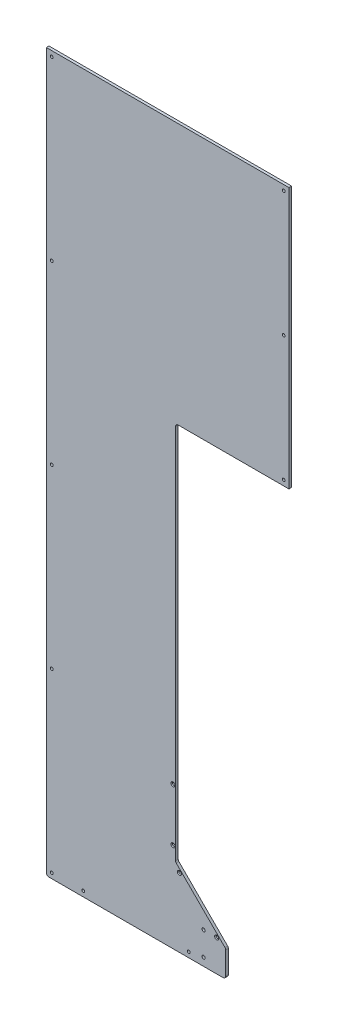
ISO-10303-21;
HEADER;
FILE_DESCRIPTION(('STEP AP214'),'2;1');
FILE_NAME('part.step','',(''),(''),'','','');
FILE_SCHEMA(('AUTOMOTIVE_DESIGN { 1 0 10303 214 1 1 1 1 }'));
ENDSEC;
DATA;
#1=APPLICATION_CONTEXT('core data for automotive mechanical design processes');
#2=APPLICATION_PROTOCOL_DEFINITION('international standard','automotive_design',2000,#1);
#3=PRODUCT_CONTEXT('',#1,'mechanical');
#4=PRODUCT('Part','Part','',(#3));
#5=PRODUCT_RELATED_PRODUCT_CATEGORY('part','',(#4));
#6=PRODUCT_DEFINITION_FORMATION('','',#4);
#7=PRODUCT_DEFINITION_CONTEXT('part definition',#1,'design');
#8=PRODUCT_DEFINITION('design','',#6,#7);
#9=PRODUCT_DEFINITION_SHAPE('','',#8);
#10=(LENGTH_UNIT() NAMED_UNIT(*) SI_UNIT(.MILLI.,.METRE.));
#11=(NAMED_UNIT(*) PLANE_ANGLE_UNIT() SI_UNIT($,.RADIAN.));
#12=(NAMED_UNIT(*) SI_UNIT($,.STERADIAN.) SOLID_ANGLE_UNIT());
#13=UNCERTAINTY_MEASURE_WITH_UNIT(LENGTH_MEASURE(1.E-05),#10,'distance_accuracy_value','');
#14=(GEOMETRIC_REPRESENTATION_CONTEXT(3) GLOBAL_UNCERTAINTY_ASSIGNED_CONTEXT((#13)) GLOBAL_UNIT_ASSIGNED_CONTEXT((#10,
#11,#12)) REPRESENTATION_CONTEXT('',''));
#15=CARTESIAN_POINT('',(0.,0.,0.));
#16=DIRECTION('',(0.,0.,1.));
#17=DIRECTION('',(1.,0.,0.));
#18=AXIS2_PLACEMENT_3D('',#15,#16,#17);
#19=CARTESIAN_POINT('',(0.,0.,6.35));
#20=DIRECTION('',(0.,0.,-1.));
#21=DIRECTION('',(-1.,0.,0.));
#22=AXIS2_PLACEMENT_3D('',#19,#20,#21);
#23=PLANE('',#22);
#24=CARTESIAN_POINT('',(378.46762,76.2,6.35));
#25=DIRECTION('',(0.,0.,-1.));
#26=DIRECTION('',(-1.,0.,0.));
#27=AXIS2_PLACEMENT_3D('',#24,#25,#26);
#28=CIRCLE('',#27,3.937);
#29=CARTESIAN_POINT('',(374.53062,76.2,6.35));
#30=VERTEX_POINT('',#29);
#31=EDGE_CURVE('E702',#30,#30,#28,.T.);
#32=ORIENTED_EDGE('',*,*,#31,.T.);
#33=EDGE_LOOP('',(#32));
#34=FACE_BOUND('',#33,.T.);
#35=CARTESIAN_POINT('',(378.46762,19.05,6.35));
#36=DIRECTION('',(0.,0.,-1.));
#37=DIRECTION('',(-1.,0.,0.));
#38=AXIS2_PLACEMENT_3D('',#35,#36,#37);
#39=CIRCLE('',#38,3.937);
#40=CARTESIAN_POINT('',(374.53062,19.05,6.35));
#41=VERTEX_POINT('',#40);
#42=EDGE_CURVE('E706',#41,#41,#39,.T.);
#43=ORIENTED_EDGE('',*,*,#42,.T.);
#44=EDGE_LOOP('',(#43));
#45=FACE_BOUND('',#44,.T.);
#46=CARTESIAN_POINT('',(304.8,342.9,6.35));
#47=DIRECTION('',(0.,0.,1.));
#48=DIRECTION('',(1.,0.,0.));
#49=AXIS2_PLACEMENT_3D('',#46,#47,#48);
#50=CIRCLE('',#49,4.88949999999999);
#51=CARTESIAN_POINT('',(309.6895,342.9,6.35));
#52=VERTEX_POINT('',#51);
#53=EDGE_CURVE('E708',#52,#52,#50,.T.);
#54=ORIENTED_EDGE('',*,*,#53,.F.);
#55=EDGE_LOOP('',(#54));
#56=FACE_BOUND('',#55,.T.);
#57=CARTESIAN_POINT('',(304.8,215.9,6.35));
#58=DIRECTION('',(0.,0.,1.));
#59=DIRECTION('',(1.,0.,0.));
#60=AXIS2_PLACEMENT_3D('',#57,#58,#59);
#61=CIRCLE('',#60,4.88949999999999);
#62=CARTESIAN_POINT('',(309.6895,215.9,6.35));
#63=VERTEX_POINT('',#62);
#64=EDGE_CURVE('E724',#63,#63,#61,.T.);
#65=ORIENTED_EDGE('',*,*,#64,.F.);
#66=EDGE_LOOP('',(#65));
#67=FACE_BOUND('',#66,.T.);
#68=CARTESIAN_POINT('',(88.9,12.7,6.35));
#69=DIRECTION('',(0.,0.,1.));
#70=DIRECTION('',(1.,0.,0.));
#71=AXIS2_PLACEMENT_3D('',#68,#69,#70);
#72=CIRCLE('',#71,3.37819999999999);
#73=CARTESIAN_POINT('',(92.2782,12.7,6.35));
#74=VERTEX_POINT('',#73);
#75=EDGE_CURVE('E211',#74,#74,#72,.T.);
#76=ORIENTED_EDGE('',*,*,#75,.F.);
#77=EDGE_LOOP('',(#76));
#78=FACE_BOUND('',#77,.T.);
#79=CARTESIAN_POINT('',(342.9,12.7,6.35));
#80=DIRECTION('',(0.,0.,1.));
#81=DIRECTION('',(1.,0.,0.));
#82=AXIS2_PLACEMENT_3D('',#79,#80,#81);
#83=CIRCLE('',#82,3.37819999999999);
#84=CARTESIAN_POINT('',(346.2782,12.7,6.35));
#85=VERTEX_POINT('',#84);
#86=EDGE_CURVE('E217',#85,#85,#83,.T.);
#87=ORIENTED_EDGE('',*,*,#86,.F.);
#88=EDGE_LOOP('',(#87));
#89=FACE_BOUND('',#88,.T.);
#90=CARTESIAN_POINT('',(12.7,1714.5,6.35));
#91=DIRECTION('',(0.,0.,1.));
#92=DIRECTION('',(1.,0.,0.));
#93=AXIS2_PLACEMENT_3D('',#90,#91,#92);
#94=CIRCLE('',#93,3.37819999999999);
#95=CARTESIAN_POINT('',(16.0782,1714.5,6.35));
#96=VERTEX_POINT('',#95);
#97=EDGE_CURVE('E215',#96,#96,#94,.T.);
#98=ORIENTED_EDGE('',*,*,#97,.F.);
#99=EDGE_LOOP('',(#98));
#100=FACE_BOUND('',#99,.T.);
#101=CARTESIAN_POINT('',(12.7,1289.05,6.35));
#102=DIRECTION('',(0.,0.,1.));
#103=DIRECTION('',(1.,0.,0.));
#104=AXIS2_PLACEMENT_3D('',#101,#102,#103);
#105=CIRCLE('',#104,3.37819999999999);
#106=CARTESIAN_POINT('',(16.0782,1289.05,6.35));
#107=VERTEX_POINT('',#106);
#108=EDGE_CURVE('E232',#107,#107,#105,.T.);
#109=ORIENTED_EDGE('',*,*,#108,.F.);
#110=EDGE_LOOP('',(#109));
#111=FACE_BOUND('',#110,.T.);
#112=CARTESIAN_POINT('',(12.7,863.6,6.35));
#113=DIRECTION('',(0.,0.,1.));
#114=DIRECTION('',(1.,0.,0.));
#115=AXIS2_PLACEMENT_3D('',#112,#113,#114);
#116=CIRCLE('',#115,3.37819999999999);
#117=CARTESIAN_POINT('',(16.0782,863.6,6.35));
#118=VERTEX_POINT('',#117);
#119=EDGE_CURVE('E238',#118,#118,#116,.T.);
#120=ORIENTED_EDGE('',*,*,#119,.F.);
#121=EDGE_LOOP('',(#120));
#122=FACE_BOUND('',#121,.T.);
#123=CARTESIAN_POINT('',(12.7,438.15,6.35));
#124=DIRECTION('',(0.,0.,1.));
#125=DIRECTION('',(1.,0.,0.));
#126=AXIS2_PLACEMENT_3D('',#123,#124,#125);
#127=CIRCLE('',#126,3.37819999999999);
#128=CARTESIAN_POINT('',(16.0782,438.15,6.35));
#129=VERTEX_POINT('',#128);
#130=EDGE_CURVE('E244',#129,#129,#127,.T.);
#131=ORIENTED_EDGE('',*,*,#130,.F.);
#132=EDGE_LOOP('',(#131));
#133=FACE_BOUND('',#132,.T.);
#134=CARTESIAN_POINT('',(12.7,12.7,6.35));
#135=DIRECTION('',(0.,0.,1.));
#136=DIRECTION('',(1.,0.,0.));
#137=AXIS2_PLACEMENT_3D('',#134,#135,#136);
#138=CIRCLE('',#137,3.37819999999999);
#139=CARTESIAN_POINT('',(16.0782,12.7,6.35));
#140=VERTEX_POINT('',#139);
#141=EDGE_CURVE('E250',#140,#140,#138,.T.);
#142=ORIENTED_EDGE('',*,*,#141,.F.);
#143=EDGE_LOOP('',(#142));
#144=FACE_BOUND('',#143,.T.);
#145=CARTESIAN_POINT('',(571.5,1111.25,6.35));
#146=DIRECTION('',(0.,0.,1.));
#147=DIRECTION('',(1.,0.,0.));
#148=AXIS2_PLACEMENT_3D('',#145,#146,#147);
#149=CIRCLE('',#148,3.3782);
#150=CARTESIAN_POINT('',(574.8782,1111.25,6.35));
#151=VERTEX_POINT('',#150);
#152=EDGE_CURVE('E256',#151,#151,#149,.T.);
#153=ORIENTED_EDGE('',*,*,#152,.F.);
#154=EDGE_LOOP('',(#153));
#155=FACE_BOUND('',#154,.T.);
#156=CARTESIAN_POINT('',(571.5,1412.875,6.35));
#157=DIRECTION('',(0.,0.,1.));
#158=DIRECTION('',(1.,0.,0.));
#159=AXIS2_PLACEMENT_3D('',#156,#157,#158);
#160=CIRCLE('',#159,3.3782);
#161=CARTESIAN_POINT('',(574.8782,1412.875,6.35));
#162=VERTEX_POINT('',#161);
#163=EDGE_CURVE('E262',#162,#162,#160,.T.);
#164=ORIENTED_EDGE('',*,*,#163,.F.);
#165=EDGE_LOOP('',(#164));
#166=FACE_BOUND('',#165,.T.);
#167=CARTESIAN_POINT('',(571.5,1714.5,6.35));
#168=DIRECTION('',(0.,0.,1.));
#169=DIRECTION('',(1.,0.,0.));
#170=AXIS2_PLACEMENT_3D('',#167,#168,#169);
#171=CIRCLE('',#170,3.3782);
#172=CARTESIAN_POINT('',(574.8782,1714.5,6.35));
#173=VERTEX_POINT('',#172);
#174=EDGE_CURVE('E268',#173,#173,#171,.T.);
#175=ORIENTED_EDGE('',*,*,#174,.F.);
#176=EDGE_LOOP('',(#175));
#177=FACE_BOUND('',#176,.T.);
#178=DIRECTION('',(0.,-1.,0.));
#179=VECTOR('',#178,1.);
#180=CARTESIAN_POINT('',(0.,0.,6.35));
#181=LINE('',#180,#179);
#182=CARTESIAN_POINT('',(0.,1727.2,6.35));
#183=VERTEX_POINT('',#182);
#184=CARTESIAN_POINT('',(0.,6.35,6.35));
#185=VERTEX_POINT('',#184);
#186=EDGE_CURVE('E158',#183,#185,#181,.T.);
#187=ORIENTED_EDGE('',*,*,#186,.T.);
#188=CARTESIAN_POINT('',(6.35,6.35,6.35));
#189=DIRECTION('',(0.,0.,-1.));
#190=DIRECTION('',(-1.,0.,0.));
#191=AXIS2_PLACEMENT_3D('',#188,#189,#190);
#192=CIRCLE('',#191,6.35);
#193=CARTESIAN_POINT('',(6.35,0.,6.35));
#194=VERTEX_POINT('',#193);
#195=EDGE_CURVE('E188',#185,#194,#192,.F.);
#196=ORIENTED_EDGE('',*,*,#195,.T.);
#197=DIRECTION('',(1.,0.,0.));
#198=VECTOR('',#197,1.);
#199=CARTESIAN_POINT('',(0.,0.,6.35));
#200=LINE('',#199,#198);
#201=CARTESIAN_POINT('',(425.45,0.,6.35));
#202=VERTEX_POINT('',#201);
#203=EDGE_CURVE('E292',#194,#202,#200,.T.);
#204=ORIENTED_EDGE('',*,*,#203,.T.);
#205=CARTESIAN_POINT('',(425.45,6.35,6.35));
#206=DIRECTION('',(0.,0.,-1.));
#207=DIRECTION('',(-1.,0.,0.));
#208=AXIS2_PLACEMENT_3D('',#205,#206,#207);
#209=CIRCLE('',#208,6.35);
#210=CARTESIAN_POINT('',(431.8,6.35,6.35));
#211=VERTEX_POINT('',#210);
#212=EDGE_CURVE('E186',#202,#211,#209,.F.);
#213=ORIENTED_EDGE('',*,*,#212,.T.);
#214=DIRECTION('',(0.,-1.,0.));
#215=VECTOR('',#214,1.);
#216=CARTESIAN_POINT('',(431.8,63.5,6.35));
#217=LINE('',#216,#215);
#218=CARTESIAN_POINT('',(431.8,60.8697438789308,6.35));
#219=VERTEX_POINT('',#218);
#220=EDGE_CURVE('E139',#219,#211,#217,.T.);
#221=ORIENTED_EDGE('',*,*,#220,.F.);
#222=CARTESIAN_POINT('',(425.45,60.8697438789308,6.35));
#223=DIRECTION('',(0.,0.,-1.));
#224=DIRECTION('',(-1.,0.,0.));
#225=AXIS2_PLACEMENT_3D('',#222,#223,#224);
#226=CIRCLE('',#225,6.35);
#227=CARTESIAN_POINT('',(429.940128060535,65.3598719394654,6.35));
#228=VERTEX_POINT('',#227);
#229=EDGE_CURVE('E184',#219,#228,#226,.F.);
#230=ORIENTED_EDGE('',*,*,#229,.T.);
#231=DIRECTION('',(0.70710678118655,-0.707106781186545,0.));
#232=VECTOR('',#231,1.);
#233=CARTESIAN_POINT('',(311.15,184.149999999999,6.35));
#234=LINE('',#233,#232);
#235=CARTESIAN_POINT('',(313.009871939466,182.290128060534,6.35));
#236=VERTEX_POINT('',#235);
#237=EDGE_CURVE('E285',#236,#228,#234,.T.);
#238=ORIENTED_EDGE('',*,*,#237,.F.);
#239=CARTESIAN_POINT('',(317.5,186.780256121068,6.35));
#240=DIRECTION('',(0.,0.,-1.));
#241=DIRECTION('',(-1.,0.,0.));
#242=AXIS2_PLACEMENT_3D('',#239,#240,#241);
#243=CIRCLE('',#242,6.35);
#244=CARTESIAN_POINT('',(311.15,186.780256121068,6.35));
#245=VERTEX_POINT('',#244);
#246=EDGE_CURVE('E57',#236,#245,#243,.T.);
#247=ORIENTED_EDGE('',*,*,#246,.T.);
#248=DIRECTION('',(0.,-1.,0.));
#249=VECTOR('',#248,1.);
#250=CARTESIAN_POINT('',(311.15,1098.55,6.35));
#251=LINE('',#250,#249);
#252=CARTESIAN_POINT('',(311.15,1092.2,6.35));
#253=VERTEX_POINT('',#252);
#254=EDGE_CURVE('E283',#253,#245,#251,.T.);
#255=ORIENTED_EDGE('',*,*,#254,.F.);
#256=CARTESIAN_POINT('',(317.5,1092.2,6.35));
#257=DIRECTION('',(0.,0.,-1.));
#258=DIRECTION('',(-1.,0.,0.));
#259=AXIS2_PLACEMENT_3D('',#256,#257,#258);
#260=CIRCLE('',#259,6.35);
#261=CARTESIAN_POINT('',(317.5,1098.55,6.35));
#262=VERTEX_POINT('',#261);
#263=EDGE_CURVE('E44',#253,#262,#260,.T.);
#264=ORIENTED_EDGE('',*,*,#263,.T.);
#265=DIRECTION('',(-1.,0.,0.));
#266=VECTOR('',#265,1.);
#267=CARTESIAN_POINT('',(584.2,1098.55,6.35));
#268=LINE('',#267,#266);
#269=CARTESIAN_POINT('',(584.2,1098.55,6.35));
#270=VERTEX_POINT('',#269);
#271=EDGE_CURVE('E273',#270,#262,#268,.T.);
#272=ORIENTED_EDGE('',*,*,#271,.F.);
#273=DIRECTION('',(0.,1.,0.));
#274=VECTOR('',#273,1.);
#275=CARTESIAN_POINT('',(584.2,0.,6.35));
#276=LINE('',#275,#274);
#277=CARTESIAN_POINT('',(584.2,1727.2,6.35));
#278=VERTEX_POINT('',#277);
#279=EDGE_CURVE('E147',#270,#278,#276,.T.);
#280=ORIENTED_EDGE('',*,*,#279,.T.);
#281=DIRECTION('',(-1.,0.,0.));
#282=VECTOR('',#281,1.);
#283=CARTESIAN_POINT('',(0.,1727.2,6.35));
#284=LINE('',#283,#282);
#285=EDGE_CURVE('E168',#278,#183,#284,.T.);
#286=ORIENTED_EDGE('',*,*,#285,.T.);
#287=EDGE_LOOP('',(#187,#196,#204,#213,#221,#230,#238,#247,#255,#264,#272,#280,#286));
#288=FACE_BOUND('',#287,.T.);
#289=CARTESIAN_POINT('',(410.11974387893,76.2,6.35));
#290=DIRECTION('',(0.,0.,1.));
#291=DIRECTION('',(1.,0.,0.));
#292=AXIS2_PLACEMENT_3D('',#289,#290,#291);
#293=CIRCLE('',#292,4.88949999999999);
#294=CARTESIAN_POINT('',(415.00924387893,76.2,6.35));
#295=VERTEX_POINT('',#294);
#296=EDGE_CURVE('E742',#295,#295,#293,.T.);
#297=ORIENTED_EDGE('',*,*,#296,.F.);
#298=EDGE_LOOP('',(#297));
#299=FACE_BOUND('',#298,.T.);
#300=CARTESIAN_POINT('',(320.317182668239,166.002561210692,6.35));
#301=DIRECTION('',(0.,0.,1.));
#302=DIRECTION('',(1.,0.,0.));
#303=AXIS2_PLACEMENT_3D('',#300,#301,#302);
#304=CIRCLE('',#303,4.88949999999999);
#305=CARTESIAN_POINT('',(325.206682668239,166.002561210692,6.35));
#306=VERTEX_POINT('',#305);
#307=EDGE_CURVE('E733',#306,#306,#304,.T.);
#308=ORIENTED_EDGE('',*,*,#307,.F.);
#309=EDGE_LOOP('',(#308));
#310=FACE_BOUND('',#309,.T.);
#311=ADVANCED_FACE('F35',(#34,#45,#56,#67,#78,#89,#100,#111,#122,#133,#144,#155,#166,#177,#288,
#299,#310),#23,.F.);
#312=CARTESIAN_POINT('',(0.,0.,6.35));
#313=DIRECTION('',(1.,0.,0.));
#314=DIRECTION('',(0.,0.,-1.));
#315=AXIS2_PLACEMENT_3D('',#312,#313,#314);
#316=PLANE('',#315);
#317=DIRECTION('',(0.,-1.,0.));
#318=VECTOR('',#317,1.);
#319=CARTESIAN_POINT('',(0.,0.,0.));
#320=LINE('',#319,#318);
#321=CARTESIAN_POINT('',(0.,1727.2,0.));
#322=VERTEX_POINT('',#321);
#323=CARTESIAN_POINT('',(0.,6.35,0.));
#324=VERTEX_POINT('',#323);
#325=EDGE_CURVE('E148',#322,#324,#320,.T.);
#326=ORIENTED_EDGE('',*,*,#325,.T.);
#327=DIRECTION('',(0.,0.,-1.));
#328=VECTOR('',#327,1.);
#329=CARTESIAN_POINT('',(0.,6.35,6.35));
#330=LINE('',#329,#328);
#331=EDGE_CURVE('E182',#324,#185,#330,.F.);
#332=ORIENTED_EDGE('',*,*,#331,.T.);
#333=ORIENTED_EDGE('',*,*,#186,.F.);
#334=DIRECTION('',(0.,0.,-1.));
#335=VECTOR('',#334,1.);
#336=CARTESIAN_POINT('',(0.,1727.2,6.35));
#337=LINE('',#336,#335);
#338=EDGE_CURVE('E164',#183,#322,#337,.T.);
#339=ORIENTED_EDGE('',*,*,#338,.T.);
#340=EDGE_LOOP('',(#326,#332,#333,#339));
#341=FACE_BOUND('',#340,.T.);
#342=ADVANCED_FACE('F299',(#341),#316,.F.);
#343=CARTESIAN_POINT('',(0.,0.,6.35));
#344=DIRECTION('',(0.,1.,0.));
#345=DIRECTION('',(0.,0.,1.));
#346=AXIS2_PLACEMENT_3D('',#343,#344,#345);
#347=PLANE('',#346);
#348=ORIENTED_EDGE('',*,*,#203,.F.);
#349=DIRECTION('',(0.,0.,-1.));
#350=VECTOR('',#349,1.);
#351=CARTESIAN_POINT('',(6.35,0.,6.35));
#352=LINE('',#351,#350);
#353=CARTESIAN_POINT('',(6.35,0.,0.));
#354=VERTEX_POINT('',#353);
#355=EDGE_CURVE('E173',#194,#354,#352,.T.);
#356=ORIENTED_EDGE('',*,*,#355,.T.);
#357=DIRECTION('',(1.,0.,0.));
#358=VECTOR('',#357,1.);
#359=CARTESIAN_POINT('',(0.,0.,0.));
#360=LINE('',#359,#358);
#361=CARTESIAN_POINT('',(425.45,0.,0.));
#362=VERTEX_POINT('',#361);
#363=EDGE_CURVE('E156',#354,#362,#360,.T.);
#364=ORIENTED_EDGE('',*,*,#363,.T.);
#365=DIRECTION('',(0.,0.,1.));
#366=VECTOR('',#365,1.);
#367=CARTESIAN_POINT('',(425.45,0.,6.35));
#368=LINE('',#367,#366);
#369=EDGE_CURVE('E170',#362,#202,#368,.T.);
#370=ORIENTED_EDGE('',*,*,#369,.T.);
#371=EDGE_LOOP('',(#348,#356,#364,#370));
#372=FACE_BOUND('',#371,.T.);
#373=ADVANCED_FACE('F309',(#372),#347,.F.);
#374=CARTESIAN_POINT('',(584.2,0.,6.35));
#375=DIRECTION('',(-1.,0.,0.));
#376=DIRECTION('',(0.,0.,1.));
#377=AXIS2_PLACEMENT_3D('',#374,#375,#376);
#378=PLANE('',#377);
#379=ORIENTED_EDGE('',*,*,#279,.F.);
#380=DIRECTION('',(0.,0.,1.));
#381=VECTOR('',#380,1.);
#382=CARTESIAN_POINT('',(584.2,1098.55,0.));
#383=LINE('',#382,#381);
#384=CARTESIAN_POINT('',(584.2,1098.55,0.));
#385=VERTEX_POINT('',#384);
#386=EDGE_CURVE('E132',#385,#270,#383,.T.);
#387=ORIENTED_EDGE('',*,*,#386,.F.);
#388=DIRECTION('',(0.,1.,0.));
#389=VECTOR('',#388,1.);
#390=CARTESIAN_POINT('',(584.2,0.,0.));
#391=LINE('',#390,#389);
#392=CARTESIAN_POINT('',(584.2,1727.2,0.));
#393=VERTEX_POINT('',#392);
#394=EDGE_CURVE('E145',#385,#393,#391,.T.);
#395=ORIENTED_EDGE('',*,*,#394,.T.);
#396=DIRECTION('',(0.,0.,-1.));
#397=VECTOR('',#396,1.);
#398=CARTESIAN_POINT('',(584.2,1727.2,6.35));
#399=LINE('',#398,#397);
#400=EDGE_CURVE('E167',#278,#393,#399,.T.);
#401=ORIENTED_EDGE('',*,*,#400,.F.);
#402=EDGE_LOOP('',(#379,#387,#395,#401));
#403=FACE_BOUND('',#402,.T.);
#404=ADVANCED_FACE('F143',(#403),#378,.F.);
#405=CARTESIAN_POINT('',(0.,1727.2,6.35));
#406=DIRECTION('',(0.,-1.,0.));
#407=DIRECTION('',(0.,0.,-1.));
#408=AXIS2_PLACEMENT_3D('',#405,#406,#407);
#409=PLANE('',#408);
#410=DIRECTION('',(-1.,0.,0.));
#411=VECTOR('',#410,1.);
#412=CARTESIAN_POINT('',(0.,1727.2,0.));
#413=LINE('',#412,#411);
#414=EDGE_CURVE('E155',#393,#322,#413,.T.);
#415=ORIENTED_EDGE('',*,*,#414,.T.);
#416=ORIENTED_EDGE('',*,*,#338,.F.);
#417=ORIENTED_EDGE('',*,*,#285,.F.);
#418=ORIENTED_EDGE('',*,*,#400,.T.);
#419=EDGE_LOOP('',(#415,#416,#417,#418));
#420=FACE_BOUND('',#419,.T.);
#421=ADVANCED_FACE('F359',(#420),#409,.F.);
#422=CARTESIAN_POINT('',(0.,0.,0.));
#423=DIRECTION('',(0.,0.,-1.));
#424=DIRECTION('',(-1.,0.,0.));
#425=AXIS2_PLACEMENT_3D('',#422,#423,#424);
#426=PLANE('',#425);
#427=CARTESIAN_POINT('',(378.46762,76.2,0.));
#428=DIRECTION('',(0.,0.,-1.));
#429=DIRECTION('',(-1.,0.,0.));
#430=AXIS2_PLACEMENT_3D('',#427,#428,#429);
#431=CIRCLE('',#430,3.937);
#432=CARTESIAN_POINT('',(374.53062,76.2,0.));
#433=VERTEX_POINT('',#432);
#434=EDGE_CURVE('E705',#433,#433,#431,.T.);
#435=ORIENTED_EDGE('',*,*,#434,.F.);
#436=EDGE_LOOP('',(#435));
#437=FACE_BOUND('',#436,.T.);
#438=CARTESIAN_POINT('',(378.46762,19.05,0.));
#439=DIRECTION('',(0.,0.,-1.));
#440=DIRECTION('',(-1.,0.,0.));
#441=AXIS2_PLACEMENT_3D('',#438,#439,#440);
#442=CIRCLE('',#441,3.937);
#443=CARTESIAN_POINT('',(374.53062,19.05,0.));
#444=VERTEX_POINT('',#443);
#445=EDGE_CURVE('E711',#444,#444,#442,.T.);
#446=ORIENTED_EDGE('',*,*,#445,.F.);
#447=EDGE_LOOP('',(#446));
#448=FACE_BOUND('',#447,.T.);
#449=CARTESIAN_POINT('',(304.8,342.9,0.));
#450=DIRECTION('',(0.,0.,-1.));
#451=DIRECTION('',(-1.,0.,0.));
#452=AXIS2_PLACEMENT_3D('',#449,#450,#451);
#453=CIRCLE('',#452,2.8067);
#454=CARTESIAN_POINT('',(301.9933,342.9,0.));
#455=VERTEX_POINT('',#454);
#456=EDGE_CURVE('E721',#455,#455,#453,.T.);
#457=ORIENTED_EDGE('',*,*,#456,.F.);
#458=EDGE_LOOP('',(#457));
#459=FACE_BOUND('',#458,.T.);
#460=CARTESIAN_POINT('',(304.8,215.9,0.));
#461=DIRECTION('',(0.,0.,-1.));
#462=DIRECTION('',(-1.,0.,0.));
#463=AXIS2_PLACEMENT_3D('',#460,#461,#462);
#464=CIRCLE('',#463,2.8067);
#465=CARTESIAN_POINT('',(301.9933,215.9,0.));
#466=VERTEX_POINT('',#465);
#467=EDGE_CURVE('E730',#466,#466,#464,.T.);
#468=ORIENTED_EDGE('',*,*,#467,.F.);
#469=EDGE_LOOP('',(#468));
#470=FACE_BOUND('',#469,.T.);
#471=CARTESIAN_POINT('',(320.317182668239,166.002561210692,0.));
#472=DIRECTION('',(0.,0.,-1.));
#473=DIRECTION('',(-1.,0.,0.));
#474=AXIS2_PLACEMENT_3D('',#471,#472,#473);
#475=CIRCLE('',#474,2.8067);
#476=CARTESIAN_POINT('',(317.510482668239,166.002561210692,0.));
#477=VERTEX_POINT('',#476);
#478=EDGE_CURVE('E739',#477,#477,#475,.T.);
#479=ORIENTED_EDGE('',*,*,#478,.F.);
#480=EDGE_LOOP('',(#479));
#481=FACE_BOUND('',#480,.T.);
#482=CARTESIAN_POINT('',(410.11974387893,76.2,0.));
#483=DIRECTION('',(0.,0.,-1.));
#484=DIRECTION('',(-1.,0.,0.));
#485=AXIS2_PLACEMENT_3D('',#482,#483,#484);
#486=CIRCLE('',#485,2.8067);
#487=CARTESIAN_POINT('',(407.31304387893,76.2,0.));
#488=VERTEX_POINT('',#487);
#489=EDGE_CURVE('E222',#488,#488,#486,.T.);
#490=ORIENTED_EDGE('',*,*,#489,.F.);
#491=EDGE_LOOP('',(#490));
#492=FACE_BOUND('',#491,.T.);
#493=CARTESIAN_POINT('',(88.9,12.7,0.));
#494=DIRECTION('',(0.,0.,-1.));
#495=DIRECTION('',(-1.,0.,0.));
#496=AXIS2_PLACEMENT_3D('',#493,#494,#495);
#497=CIRCLE('',#496,3.37819999999999);
#498=CARTESIAN_POINT('',(85.5218,12.7,0.));
#499=VERTEX_POINT('',#498);
#500=EDGE_CURVE('E39',#499,#499,#497,.T.);
#501=ORIENTED_EDGE('',*,*,#500,.F.);
#502=EDGE_LOOP('',(#501));
#503=FACE_BOUND('',#502,.T.);
#504=CARTESIAN_POINT('',(342.9,12.7,0.));
#505=DIRECTION('',(0.,0.,-1.));
#506=DIRECTION('',(-1.,0.,0.));
#507=AXIS2_PLACEMENT_3D('',#504,#505,#506);
#508=CIRCLE('',#507,3.37819999999999);
#509=CARTESIAN_POINT('',(339.5218,12.7,0.));
#510=VERTEX_POINT('',#509);
#511=EDGE_CURVE('E209',#510,#510,#508,.T.);
#512=ORIENTED_EDGE('',*,*,#511,.F.);
#513=EDGE_LOOP('',(#512));
#514=FACE_BOUND('',#513,.T.);
#515=CARTESIAN_POINT('',(12.7,1714.5,0.));
#516=DIRECTION('',(0.,0.,1.));
#517=DIRECTION('',(1.,0.,0.));
#518=AXIS2_PLACEMENT_3D('',#515,#516,#517);
#519=CIRCLE('',#518,3.37819999999999);
#520=CARTESIAN_POINT('',(16.0782,1714.5,0.));
#521=VERTEX_POINT('',#520);
#522=EDGE_CURVE('E229',#521,#521,#519,.T.);
#523=ORIENTED_EDGE('',*,*,#522,.T.);
#524=EDGE_LOOP('',(#523));
#525=FACE_BOUND('',#524,.T.);
#526=CARTESIAN_POINT('',(12.7,1289.05,0.));
#527=DIRECTION('',(0.,0.,1.));
#528=DIRECTION('',(1.,0.,0.));
#529=AXIS2_PLACEMENT_3D('',#526,#527,#528);
#530=CIRCLE('',#529,3.37819999999999);
#531=CARTESIAN_POINT('',(16.0782,1289.05,0.));
#532=VERTEX_POINT('',#531);
#533=EDGE_CURVE('E235',#532,#532,#530,.T.);
#534=ORIENTED_EDGE('',*,*,#533,.T.);
#535=EDGE_LOOP('',(#534));
#536=FACE_BOUND('',#535,.T.);
#537=CARTESIAN_POINT('',(12.7,863.6,0.));
#538=DIRECTION('',(0.,0.,1.));
#539=DIRECTION('',(1.,0.,0.));
#540=AXIS2_PLACEMENT_3D('',#537,#538,#539);
#541=CIRCLE('',#540,3.37819999999999);
#542=CARTESIAN_POINT('',(16.0782,863.6,0.));
#543=VERTEX_POINT('',#542);
#544=EDGE_CURVE('E241',#543,#543,#541,.T.);
#545=ORIENTED_EDGE('',*,*,#544,.T.);
#546=EDGE_LOOP('',(#545));
#547=FACE_BOUND('',#546,.T.);
#548=CARTESIAN_POINT('',(12.7,438.15,0.));
#549=DIRECTION('',(0.,0.,1.));
#550=DIRECTION('',(1.,0.,0.));
#551=AXIS2_PLACEMENT_3D('',#548,#549,#550);
#552=CIRCLE('',#551,3.37819999999999);
#553=CARTESIAN_POINT('',(16.0782,438.15,0.));
#554=VERTEX_POINT('',#553);
#555=EDGE_CURVE('E247',#554,#554,#552,.T.);
#556=ORIENTED_EDGE('',*,*,#555,.T.);
#557=EDGE_LOOP('',(#556));
#558=FACE_BOUND('',#557,.T.);
#559=CARTESIAN_POINT('',(12.7,12.7,0.));
#560=DIRECTION('',(0.,0.,1.));
#561=DIRECTION('',(1.,0.,0.));
#562=AXIS2_PLACEMENT_3D('',#559,#560,#561);
#563=CIRCLE('',#562,3.37819999999999);
#564=CARTESIAN_POINT('',(16.0782,12.7,0.));
#565=VERTEX_POINT('',#564);
#566=EDGE_CURVE('E253',#565,#565,#563,.T.);
#567=ORIENTED_EDGE('',*,*,#566,.T.);
#568=EDGE_LOOP('',(#567));
#569=FACE_BOUND('',#568,.T.);
#570=CARTESIAN_POINT('',(571.5,1111.25,0.));
#571=DIRECTION('',(0.,0.,1.));
#572=DIRECTION('',(1.,0.,0.));
#573=AXIS2_PLACEMENT_3D('',#570,#571,#572);
#574=CIRCLE('',#573,3.3782);
#575=CARTESIAN_POINT('',(574.8782,1111.25,0.));
#576=VERTEX_POINT('',#575);
#577=EDGE_CURVE('E259',#576,#576,#574,.T.);
#578=ORIENTED_EDGE('',*,*,#577,.T.);
#579=EDGE_LOOP('',(#578));
#580=FACE_BOUND('',#579,.T.);
#581=CARTESIAN_POINT('',(571.5,1412.875,0.));
#582=DIRECTION('',(0.,0.,1.));
#583=DIRECTION('',(1.,0.,0.));
#584=AXIS2_PLACEMENT_3D('',#581,#582,#583);
#585=CIRCLE('',#584,3.3782);
#586=CARTESIAN_POINT('',(574.8782,1412.875,0.));
#587=VERTEX_POINT('',#586);
#588=EDGE_CURVE('E265',#587,#587,#585,.T.);
#589=ORIENTED_EDGE('',*,*,#588,.T.);
#590=EDGE_LOOP('',(#589));
#591=FACE_BOUND('',#590,.T.);
#592=CARTESIAN_POINT('',(571.5,1714.5,0.));
#593=DIRECTION('',(0.,0.,1.));
#594=DIRECTION('',(1.,0.,0.));
#595=AXIS2_PLACEMENT_3D('',#592,#593,#594);
#596=CIRCLE('',#595,3.3782);
#597=CARTESIAN_POINT('',(574.8782,1714.5,0.));
#598=VERTEX_POINT('',#597);
#599=EDGE_CURVE('E271',#598,#598,#596,.T.);
#600=ORIENTED_EDGE('',*,*,#599,.T.);
#601=EDGE_LOOP('',(#600));
#602=FACE_BOUND('',#601,.T.);
#603=ORIENTED_EDGE('',*,*,#363,.F.);
#604=CARTESIAN_POINT('',(6.35,6.35,0.));
#605=DIRECTION('',(0.,0.,-1.));
#606=DIRECTION('',(-1.,0.,0.));
#607=AXIS2_PLACEMENT_3D('',#604,#605,#606);
#608=CIRCLE('',#607,6.35);
#609=EDGE_CURVE('E180',#354,#324,#608,.T.);
#610=ORIENTED_EDGE('',*,*,#609,.T.);
#611=ORIENTED_EDGE('',*,*,#325,.F.);
#612=ORIENTED_EDGE('',*,*,#414,.F.);
#613=ORIENTED_EDGE('',*,*,#394,.F.);
#614=DIRECTION('',(-1.,0.,0.));
#615=VECTOR('',#614,1.);
#616=CARTESIAN_POINT('',(584.2,1098.55,0.));
#617=LINE('',#616,#615);
#618=CARTESIAN_POINT('',(317.5,1098.55,0.));
#619=VERTEX_POINT('',#618);
#620=EDGE_CURVE('E129',#385,#619,#617,.T.);
#621=ORIENTED_EDGE('',*,*,#620,.T.);
#622=CARTESIAN_POINT('',(317.5,1092.2,0.));
#623=DIRECTION('',(0.,0.,-1.));
#624=DIRECTION('',(-1.,0.,0.));
#625=AXIS2_PLACEMENT_3D('',#622,#623,#624);
#626=CIRCLE('',#625,6.35);
#627=CARTESIAN_POINT('',(311.15,1092.2,0.));
#628=VERTEX_POINT('',#627);
#629=EDGE_CURVE('E11',#619,#628,#626,.F.);
#630=ORIENTED_EDGE('',*,*,#629,.T.);
#631=DIRECTION('',(0.,-1.,0.));
#632=VECTOR('',#631,1.);
#633=CARTESIAN_POINT('',(311.15,1098.55,0.));
#634=LINE('',#633,#632);
#635=CARTESIAN_POINT('',(311.15,186.780256121068,0.));
#636=VERTEX_POINT('',#635);
#637=EDGE_CURVE('E138',#628,#636,#634,.T.);
#638=ORIENTED_EDGE('',*,*,#637,.T.);
#639=CARTESIAN_POINT('',(317.5,186.780256121068,0.));
#640=DIRECTION('',(0.,0.,-1.));
#641=DIRECTION('',(-1.,0.,0.));
#642=AXIS2_PLACEMENT_3D('',#639,#640,#641);
#643=CIRCLE('',#642,6.35);
#644=CARTESIAN_POINT('',(313.009871939466,182.290128060534,0.));
#645=VERTEX_POINT('',#644);
#646=EDGE_CURVE('E207',#636,#645,#643,.F.);
#647=ORIENTED_EDGE('',*,*,#646,.T.);
#648=DIRECTION('',(0.70710678118655,-0.707106781186545,0.));
#649=VECTOR('',#648,1.);
#650=CARTESIAN_POINT('',(311.15,184.149999999999,0.));
#651=LINE('',#650,#649);
#652=CARTESIAN_POINT('',(429.940128060535,65.3598719394654,0.));
#653=VERTEX_POINT('',#652);
#654=EDGE_CURVE('E277',#645,#653,#651,.T.);
#655=ORIENTED_EDGE('',*,*,#654,.T.);
#656=CARTESIAN_POINT('',(425.45,60.8697438789308,0.));
#657=DIRECTION('',(0.,0.,-1.));
#658=DIRECTION('',(-1.,0.,0.));
#659=AXIS2_PLACEMENT_3D('',#656,#657,#658);
#660=CIRCLE('',#659,6.35);
#661=CARTESIAN_POINT('',(431.8,60.8697438789308,0.));
#662=VERTEX_POINT('',#661);
#663=EDGE_CURVE('E176',#653,#662,#660,.T.);
#664=ORIENTED_EDGE('',*,*,#663,.T.);
#665=DIRECTION('',(0.,-1.,0.));
#666=VECTOR('',#665,1.);
#667=CARTESIAN_POINT('',(431.8,63.5,0.));
#668=LINE('',#667,#666);
#669=CARTESIAN_POINT('',(431.8,6.35,0.));
#670=VERTEX_POINT('',#669);
#671=EDGE_CURVE('E149',#662,#670,#668,.T.);
#672=ORIENTED_EDGE('',*,*,#671,.T.);
#673=CARTESIAN_POINT('',(425.45,6.35,0.));
#674=DIRECTION('',(0.,0.,-1.));
#675=DIRECTION('',(-1.,0.,0.));
#676=AXIS2_PLACEMENT_3D('',#673,#674,#675);
#677=CIRCLE('',#676,6.35);
#678=EDGE_CURVE('E178',#670,#362,#677,.T.);
#679=ORIENTED_EDGE('',*,*,#678,.T.);
#680=EDGE_LOOP('',(#603,#610,#611,#612,#613,#621,#630,#638,#647,#655,#664,#672,#679));
#681=FACE_BOUND('',#680,.T.);
#682=ADVANCED_FACE('F153',(#437,#448,#459,#470,#481,#492,#503,#514,#525,#536,#547,#558,#569,
#580,#591,#602,#681),#426,.T.);
#683=CARTESIAN_POINT('',(431.8,63.5,0.));
#684=DIRECTION('',(-1.,0.,0.));
#685=DIRECTION('',(0.,0.,1.));
#686=AXIS2_PLACEMENT_3D('',#683,#684,#685);
#687=PLANE('',#686);
#688=ORIENTED_EDGE('',*,*,#220,.T.);
#689=DIRECTION('',(0.,0.,1.));
#690=VECTOR('',#689,1.);
#691=CARTESIAN_POINT('',(431.8,6.35,0.));
#692=LINE('',#691,#690);
#693=EDGE_CURVE('E193',#211,#670,#692,.F.);
#694=ORIENTED_EDGE('',*,*,#693,.T.);
#695=ORIENTED_EDGE('',*,*,#671,.F.);
#696=DIRECTION('',(0.,0.,1.));
#697=VECTOR('',#696,1.);
#698=CARTESIAN_POINT('',(431.8,60.8697438789308,0.));
#699=LINE('',#698,#697);
#700=EDGE_CURVE('E190',#662,#219,#699,.T.);
#701=ORIENTED_EDGE('',*,*,#700,.T.);
#702=EDGE_LOOP('',(#688,#694,#695,#701));
#703=FACE_BOUND('',#702,.T.);
#704=ADVANCED_FACE('F317',(#703),#687,.F.);
#705=CARTESIAN_POINT('',(311.15,184.149999999999,0.));
#706=DIRECTION('',(-0.707106781186545,-0.707106781186549,0.));
#707=DIRECTION('',(0.70710678118655,-0.707106781186545,0.));
#708=AXIS2_PLACEMENT_3D('',#705,#706,#707);
#709=PLANE('',#708);
#710=ORIENTED_EDGE('',*,*,#237,.T.);
#711=DIRECTION('',(0.,0.,1.));
#712=VECTOR('',#711,1.);
#713=CARTESIAN_POINT('',(429.940128060535,65.3598719394654,0.));
#714=LINE('',#713,#712);
#715=EDGE_CURVE('E198',#228,#653,#714,.F.);
#716=ORIENTED_EDGE('',*,*,#715,.T.);
#717=ORIENTED_EDGE('',*,*,#654,.F.);
#718=DIRECTION('',(0.,0.,1.));
#719=VECTOR('',#718,1.);
#720=CARTESIAN_POINT('',(313.009871939466,182.290128060534,6.35));
#721=LINE('',#720,#719);
#722=EDGE_CURVE('E195',#645,#236,#721,.T.);
#723=ORIENTED_EDGE('',*,*,#722,.T.);
#724=EDGE_LOOP('',(#710,#716,#717,#723));
#725=FACE_BOUND('',#724,.T.);
#726=ADVANCED_FACE('F325',(#725),#709,.F.);
#727=CARTESIAN_POINT('',(311.15,1098.55,0.));
#728=DIRECTION('',(-1.,0.,0.));
#729=DIRECTION('',(0.,-1.,0.));
#730=AXIS2_PLACEMENT_3D('',#727,#728,#729);
#731=PLANE('',#730);
#732=ORIENTED_EDGE('',*,*,#254,.T.);
#733=DIRECTION('',(0.,0.,1.));
#734=VECTOR('',#733,1.);
#735=CARTESIAN_POINT('',(311.15,186.780256121068,0.));
#736=LINE('',#735,#734);
#737=EDGE_CURVE('E203',#245,#636,#736,.F.);
#738=ORIENTED_EDGE('',*,*,#737,.T.);
#739=ORIENTED_EDGE('',*,*,#637,.F.);
#740=DIRECTION('',(0.,0.,1.));
#741=VECTOR('',#740,1.);
#742=CARTESIAN_POINT('',(311.15,1092.2,6.35));
#743=LINE('',#742,#741);
#744=EDGE_CURVE('E200',#628,#253,#743,.T.);
#745=ORIENTED_EDGE('',*,*,#744,.T.);
#746=EDGE_LOOP('',(#732,#738,#739,#745));
#747=FACE_BOUND('',#746,.T.);
#748=ADVANCED_FACE('F334',(#747),#731,.F.);
#749=CARTESIAN_POINT('',(584.2,1098.55,0.));
#750=DIRECTION('',(0.,1.,0.));
#751=DIRECTION('',(0.,0.,1.));
#752=AXIS2_PLACEMENT_3D('',#749,#750,#751);
#753=PLANE('',#752);
#754=ORIENTED_EDGE('',*,*,#271,.T.);
#755=DIRECTION('',(0.,0.,1.));
#756=VECTOR('',#755,1.);
#757=CARTESIAN_POINT('',(317.5,1098.55,0.));
#758=LINE('',#757,#756);
#759=EDGE_CURVE('E134',#262,#619,#758,.F.);
#760=ORIENTED_EDGE('',*,*,#759,.T.);
#761=ORIENTED_EDGE('',*,*,#620,.F.);
#762=ORIENTED_EDGE('',*,*,#386,.T.);
#763=EDGE_LOOP('',(#754,#760,#761,#762));
#764=FACE_BOUND('',#763,.T.);
#765=ADVANCED_FACE('F131',(#764),#753,.F.);
#766=CARTESIAN_POINT('',(571.5,1714.5,6.35));
#767=DIRECTION('',(0.,0.,1.));
#768=DIRECTION('',(1.,0.,0.));
#769=AXIS2_PLACEMENT_3D('',#766,#767,#768);
#770=CYLINDRICAL_SURFACE('',#769,3.3782);
#771=ORIENTED_EDGE('',*,*,#599,.F.);
#772=EDGE_LOOP('',(#771));
#773=FACE_BOUND('',#772,.T.);
#774=ORIENTED_EDGE('',*,*,#174,.T.);
#775=EDGE_LOOP('',(#774));
#776=FACE_BOUND('',#775,.T.);
#777=ADVANCED_FACE('F547',(#773,#776),#770,.F.);
#778=CARTESIAN_POINT('',(571.5,1412.875,6.35));
#779=DIRECTION('',(0.,0.,1.));
#780=DIRECTION('',(1.,0.,0.));
#781=AXIS2_PLACEMENT_3D('',#778,#779,#780);
#782=CYLINDRICAL_SURFACE('',#781,3.3782);
#783=ORIENTED_EDGE('',*,*,#588,.F.);
#784=EDGE_LOOP('',(#783));
#785=FACE_BOUND('',#784,.T.);
#786=ORIENTED_EDGE('',*,*,#163,.T.);
#787=EDGE_LOOP('',(#786));
#788=FACE_BOUND('',#787,.T.);
#789=ADVANCED_FACE('F543',(#785,#788),#782,.F.);
#790=CARTESIAN_POINT('',(571.5,1111.25,6.35));
#791=DIRECTION('',(0.,0.,1.));
#792=DIRECTION('',(1.,0.,0.));
#793=AXIS2_PLACEMENT_3D('',#790,#791,#792);
#794=CYLINDRICAL_SURFACE('',#793,3.3782);
#795=ORIENTED_EDGE('',*,*,#577,.F.);
#796=EDGE_LOOP('',(#795));
#797=FACE_BOUND('',#796,.T.);
#798=ORIENTED_EDGE('',*,*,#152,.T.);
#799=EDGE_LOOP('',(#798));
#800=FACE_BOUND('',#799,.T.);
#801=ADVANCED_FACE('F539',(#797,#800),#794,.F.);
#802=CARTESIAN_POINT('',(12.7,12.7,6.35));
#803=DIRECTION('',(0.,0.,1.));
#804=DIRECTION('',(1.,0.,0.));
#805=AXIS2_PLACEMENT_3D('',#802,#803,#804);
#806=CYLINDRICAL_SURFACE('',#805,3.37819999999999);
#807=ORIENTED_EDGE('',*,*,#566,.F.);
#808=EDGE_LOOP('',(#807));
#809=FACE_BOUND('',#808,.T.);
#810=ORIENTED_EDGE('',*,*,#141,.T.);
#811=EDGE_LOOP('',(#810));
#812=FACE_BOUND('',#811,.T.);
#813=ADVANCED_FACE('F535',(#809,#812),#806,.F.);
#814=CARTESIAN_POINT('',(12.7,438.15,6.35));
#815=DIRECTION('',(0.,0.,1.));
#816=DIRECTION('',(1.,0.,0.));
#817=AXIS2_PLACEMENT_3D('',#814,#815,#816);
#818=CYLINDRICAL_SURFACE('',#817,3.37819999999999);
#819=ORIENTED_EDGE('',*,*,#555,.F.);
#820=EDGE_LOOP('',(#819));
#821=FACE_BOUND('',#820,.T.);
#822=ORIENTED_EDGE('',*,*,#130,.T.);
#823=EDGE_LOOP('',(#822));
#824=FACE_BOUND('',#823,.T.);
#825=ADVANCED_FACE('F531',(#821,#824),#818,.F.);
#826=CARTESIAN_POINT('',(12.7,863.6,6.35));
#827=DIRECTION('',(0.,0.,1.));
#828=DIRECTION('',(1.,0.,0.));
#829=AXIS2_PLACEMENT_3D('',#826,#827,#828);
#830=CYLINDRICAL_SURFACE('',#829,3.37819999999999);
#831=ORIENTED_EDGE('',*,*,#544,.F.);
#832=EDGE_LOOP('',(#831));
#833=FACE_BOUND('',#832,.T.);
#834=ORIENTED_EDGE('',*,*,#119,.T.);
#835=EDGE_LOOP('',(#834));
#836=FACE_BOUND('',#835,.T.);
#837=ADVANCED_FACE('F527',(#833,#836),#830,.F.);
#838=CARTESIAN_POINT('',(12.7,1289.05,6.35));
#839=DIRECTION('',(0.,0.,1.));
#840=DIRECTION('',(1.,0.,0.));
#841=AXIS2_PLACEMENT_3D('',#838,#839,#840);
#842=CYLINDRICAL_SURFACE('',#841,3.37819999999999);
#843=ORIENTED_EDGE('',*,*,#533,.F.);
#844=EDGE_LOOP('',(#843));
#845=FACE_BOUND('',#844,.T.);
#846=ORIENTED_EDGE('',*,*,#108,.T.);
#847=EDGE_LOOP('',(#846));
#848=FACE_BOUND('',#847,.T.);
#849=ADVANCED_FACE('F523',(#845,#848),#842,.F.);
#850=CARTESIAN_POINT('',(12.7,1714.5,6.35));
#851=DIRECTION('',(0.,0.,1.));
#852=DIRECTION('',(1.,0.,0.));
#853=AXIS2_PLACEMENT_3D('',#850,#851,#852);
#854=CYLINDRICAL_SURFACE('',#853,3.37819999999999);
#855=ORIENTED_EDGE('',*,*,#522,.F.);
#856=EDGE_LOOP('',(#855));
#857=FACE_BOUND('',#856,.T.);
#858=ORIENTED_EDGE('',*,*,#97,.T.);
#859=EDGE_LOOP('',(#858));
#860=FACE_BOUND('',#859,.T.);
#861=ADVANCED_FACE('F370',(#857,#860),#854,.F.);
#862=CARTESIAN_POINT('',(6.35,6.35,6.35));
#863=DIRECTION('',(0.,0.,-1.));
#864=DIRECTION('',(-1.,0.,0.));
#865=AXIS2_PLACEMENT_3D('',#862,#863,#864);
#866=CYLINDRICAL_SURFACE('',#865,6.35);
#867=ORIENTED_EDGE('',*,*,#195,.F.);
#868=ORIENTED_EDGE('',*,*,#331,.F.);
#869=ORIENTED_EDGE('',*,*,#609,.F.);
#870=ORIENTED_EDGE('',*,*,#355,.F.);
#871=EDGE_LOOP('',(#867,#868,#869,#870));
#872=FACE_BOUND('',#871,.T.);
#873=ADVANCED_FACE('F304',(#872),#866,.T.);
#874=CARTESIAN_POINT('',(425.45,6.35,6.35));
#875=DIRECTION('',(0.,0.,1.));
#876=DIRECTION('',(1.,0.,0.));
#877=AXIS2_PLACEMENT_3D('',#874,#875,#876);
#878=CYLINDRICAL_SURFACE('',#877,6.35);
#879=ORIENTED_EDGE('',*,*,#678,.F.);
#880=ORIENTED_EDGE('',*,*,#693,.F.);
#881=ORIENTED_EDGE('',*,*,#212,.F.);
#882=ORIENTED_EDGE('',*,*,#369,.F.);
#883=EDGE_LOOP('',(#879,#880,#881,#882));
#884=FACE_BOUND('',#883,.T.);
#885=ADVANCED_FACE('F313',(#884),#878,.T.);
#886=CARTESIAN_POINT('',(425.45,60.8697438789308,0.));
#887=DIRECTION('',(0.,0.,1.));
#888=DIRECTION('',(1.,0.,0.));
#889=AXIS2_PLACEMENT_3D('',#886,#887,#888);
#890=CYLINDRICAL_SURFACE('',#889,6.35);
#891=ORIENTED_EDGE('',*,*,#663,.F.);
#892=ORIENTED_EDGE('',*,*,#715,.F.);
#893=ORIENTED_EDGE('',*,*,#229,.F.);
#894=ORIENTED_EDGE('',*,*,#700,.F.);
#895=EDGE_LOOP('',(#891,#892,#893,#894));
#896=FACE_BOUND('',#895,.T.);
#897=ADVANCED_FACE('F322',(#896),#890,.T.);
#898=CARTESIAN_POINT('',(317.5,186.780256121068,0.));
#899=DIRECTION('',(0.,0.,-1.));
#900=DIRECTION('',(-1.,0.,0.));
#901=AXIS2_PLACEMENT_3D('',#898,#899,#900);
#902=CYLINDRICAL_SURFACE('',#901,6.35);
#903=ORIENTED_EDGE('',*,*,#646,.F.);
#904=ORIENTED_EDGE('',*,*,#737,.F.);
#905=ORIENTED_EDGE('',*,*,#246,.F.);
#906=ORIENTED_EDGE('',*,*,#722,.F.);
#907=EDGE_LOOP('',(#903,#904,#905,#906));
#908=FACE_BOUND('',#907,.T.);
#909=ADVANCED_FACE('F330',(#908),#902,.F.);
#910=CARTESIAN_POINT('',(317.5,1092.2,0.));
#911=DIRECTION('',(0.,0.,-1.));
#912=DIRECTION('',(-1.,0.,0.));
#913=AXIS2_PLACEMENT_3D('',#910,#911,#912);
#914=CYLINDRICAL_SURFACE('',#913,6.35);
#915=ORIENTED_EDGE('',*,*,#629,.F.);
#916=ORIENTED_EDGE('',*,*,#759,.F.);
#917=ORIENTED_EDGE('',*,*,#263,.F.);
#918=ORIENTED_EDGE('',*,*,#744,.F.);
#919=EDGE_LOOP('',(#915,#916,#917,#918));
#920=FACE_BOUND('',#919,.T.);
#921=ADVANCED_FACE('F37',(#920),#914,.F.);
#922=CARTESIAN_POINT('',(342.9,12.7,-6.35));
#923=DIRECTION('',(0.,0.,1.));
#924=DIRECTION('',(1.,0.,0.));
#925=AXIS2_PLACEMENT_3D('',#922,#923,#924);
#926=CYLINDRICAL_SURFACE('',#925,3.37819999999999);
#927=ORIENTED_EDGE('',*,*,#511,.T.);
#928=EDGE_LOOP('',(#927));
#929=FACE_BOUND('',#928,.T.);
#930=ORIENTED_EDGE('',*,*,#86,.T.);
#931=EDGE_LOOP('',(#930));
#932=FACE_BOUND('',#931,.T.);
#933=ADVANCED_FACE('F338',(#929,#932),#926,.F.);
#934=CARTESIAN_POINT('',(88.9,12.7,-6.35));
#935=DIRECTION('',(0.,0.,1.));
#936=DIRECTION('',(1.,0.,0.));
#937=AXIS2_PLACEMENT_3D('',#934,#935,#936);
#938=CYLINDRICAL_SURFACE('',#937,3.37819999999999);
#939=ORIENTED_EDGE('',*,*,#500,.T.);
#940=EDGE_LOOP('',(#939));
#941=FACE_BOUND('',#940,.T.);
#942=ORIENTED_EDGE('',*,*,#75,.T.);
#943=EDGE_LOOP('',(#942));
#944=FACE_BOUND('',#943,.T.);
#945=ADVANCED_FACE('F343',(#941,#944),#938,.F.);
#946=CARTESIAN_POINT('',(410.11974387893,76.2,6.35));
#947=DIRECTION('',(0.,0.,1.));
#948=DIRECTION('',(1.,0.,0.));
#949=AXIS2_PLACEMENT_3D('',#946,#947,#948);
#950=CYLINDRICAL_SURFACE('',#949,2.8067);
#951=CARTESIAN_POINT('',(410.11974387893,76.2,4.60232328818396));
#952=DIRECTION('',(0.,0.,1.));
#953=DIRECTION('',(1.,0.,0.));
#954=AXIS2_PLACEMENT_3D('',#951,#952,#953);
#955=CIRCLE('',#954,2.8067);
#956=CARTESIAN_POINT('',(412.92644387893,76.2,4.60232328818396));
#957=VERTEX_POINT('',#956);
#958=EDGE_CURVE('E744',#957,#957,#955,.T.);
#959=ORIENTED_EDGE('',*,*,#958,.T.);
#960=EDGE_LOOP('',(#959));
#961=FACE_BOUND('',#960,.T.);
#962=ORIENTED_EDGE('',*,*,#489,.T.);
#963=EDGE_LOOP('',(#962));
#964=FACE_BOUND('',#963,.T.);
#965=ADVANCED_FACE('F401',(#961,#964),#950,.F.);
#966=CARTESIAN_POINT('',(410.11974387893,76.2,6.35));
#967=DIRECTION('',(0.,0.,1.));
#968=DIRECTION('',(1.,0.,0.));
#969=AXIS2_PLACEMENT_3D('',#966,#967,#968);
#970=CONICAL_SURFACE('',#969,4.88949999999999,0.872664625997163);
#971=ORIENTED_EDGE('',*,*,#958,.F.);
#972=EDGE_LOOP('',(#971));
#973=FACE_BOUND('',#972,.T.);
#974=ORIENTED_EDGE('',*,*,#296,.T.);
#975=EDGE_LOOP('',(#974));
#976=FACE_BOUND('',#975,.T.);
#977=ADVANCED_FACE('F412',(#973,#976),#970,.F.);
#978=CARTESIAN_POINT('',(320.317182668239,166.002561210692,6.35));
#979=DIRECTION('',(0.,0.,1.));
#980=DIRECTION('',(1.,0.,0.));
#981=AXIS2_PLACEMENT_3D('',#978,#979,#980);
#982=CYLINDRICAL_SURFACE('',#981,2.8067);
#983=CARTESIAN_POINT('',(320.317182668239,166.002561210692,4.60232328818396));
#984=DIRECTION('',(0.,0.,1.));
#985=DIRECTION('',(1.,0.,0.));
#986=AXIS2_PLACEMENT_3D('',#983,#984,#985);
#987=CIRCLE('',#986,2.8067);
#988=CARTESIAN_POINT('',(323.123882668239,166.002561210692,4.60232328818396));
#989=VERTEX_POINT('',#988);
#990=EDGE_CURVE('E736',#989,#989,#987,.T.);
#991=ORIENTED_EDGE('',*,*,#990,.T.);
#992=EDGE_LOOP('',(#991));
#993=FACE_BOUND('',#992,.T.);
#994=ORIENTED_EDGE('',*,*,#478,.T.);
#995=EDGE_LOOP('',(#994));
#996=FACE_BOUND('',#995,.T.);
#997=ADVANCED_FACE('F422',(#993,#996),#982,.F.);
#998=CARTESIAN_POINT('',(320.317182668239,166.002561210692,6.35));
#999=DIRECTION('',(0.,0.,1.));
#1000=DIRECTION('',(1.,0.,0.));
#1001=AXIS2_PLACEMENT_3D('',#998,#999,#1000);
#1002=CONICAL_SURFACE('',#1001,4.88949999999999,0.872664625997163);
#1003=ORIENTED_EDGE('',*,*,#990,.F.);
#1004=EDGE_LOOP('',(#1003));
#1005=FACE_BOUND('',#1004,.T.);
#1006=ORIENTED_EDGE('',*,*,#307,.T.);
#1007=EDGE_LOOP('',(#1006));
#1008=FACE_BOUND('',#1007,.T.);
#1009=ADVANCED_FACE('F432',(#1005,#1008),#1002,.F.);
#1010=CARTESIAN_POINT('',(304.8,215.9,6.35));
#1011=DIRECTION('',(0.,0.,1.));
#1012=DIRECTION('',(1.,0.,0.));
#1013=AXIS2_PLACEMENT_3D('',#1010,#1011,#1012);
#1014=CYLINDRICAL_SURFACE('',#1013,2.8067);
#1015=CARTESIAN_POINT('',(304.8,215.9,4.60232328818396));
#1016=DIRECTION('',(0.,0.,1.));
#1017=DIRECTION('',(1.,0.,0.));
#1018=AXIS2_PLACEMENT_3D('',#1015,#1016,#1017);
#1019=CIRCLE('',#1018,2.8067);
#1020=CARTESIAN_POINT('',(307.6067,215.9,4.60232328818396));
#1021=VERTEX_POINT('',#1020);
#1022=EDGE_CURVE('E727',#1021,#1021,#1019,.T.);
#1023=ORIENTED_EDGE('',*,*,#1022,.T.);
#1024=EDGE_LOOP('',(#1023));
#1025=FACE_BOUND('',#1024,.T.);
#1026=ORIENTED_EDGE('',*,*,#467,.T.);
#1027=EDGE_LOOP('',(#1026));
#1028=FACE_BOUND('',#1027,.T.);
#1029=ADVANCED_FACE('F442',(#1025,#1028),#1014,.F.);
#1030=CARTESIAN_POINT('',(304.8,215.9,6.35));
#1031=DIRECTION('',(0.,0.,1.));
#1032=DIRECTION('',(1.,0.,0.));
#1033=AXIS2_PLACEMENT_3D('',#1030,#1031,#1032);
#1034=CONICAL_SURFACE('',#1033,4.88949999999999,0.872664625997163);
#1035=ORIENTED_EDGE('',*,*,#1022,.F.);
#1036=EDGE_LOOP('',(#1035));
#1037=FACE_BOUND('',#1036,.T.);
#1038=ORIENTED_EDGE('',*,*,#64,.T.);
#1039=EDGE_LOOP('',(#1038));
#1040=FACE_BOUND('',#1039,.T.);
#1041=ADVANCED_FACE('F452',(#1037,#1040),#1034,.F.);
#1042=CARTESIAN_POINT('',(304.8,342.9,6.35));
#1043=DIRECTION('',(0.,0.,1.));
#1044=DIRECTION('',(1.,0.,0.));
#1045=AXIS2_PLACEMENT_3D('',#1042,#1043,#1044);
#1046=CYLINDRICAL_SURFACE('',#1045,2.8067);
#1047=CARTESIAN_POINT('',(304.8,342.9,4.60232328818396));
#1048=DIRECTION('',(0.,0.,1.));
#1049=DIRECTION('',(1.,0.,0.));
#1050=AXIS2_PLACEMENT_3D('',#1047,#1048,#1049);
#1051=CIRCLE('',#1050,2.8067);
#1052=CARTESIAN_POINT('',(307.6067,342.9,4.60232328818396));
#1053=VERTEX_POINT('',#1052);
#1054=EDGE_CURVE('E718',#1053,#1053,#1051,.T.);
#1055=ORIENTED_EDGE('',*,*,#1054,.T.);
#1056=EDGE_LOOP('',(#1055));
#1057=FACE_BOUND('',#1056,.T.);
#1058=ORIENTED_EDGE('',*,*,#456,.T.);
#1059=EDGE_LOOP('',(#1058));
#1060=FACE_BOUND('',#1059,.T.);
#1061=ADVANCED_FACE('F462',(#1057,#1060),#1046,.F.);
#1062=CARTESIAN_POINT('',(304.8,342.9,6.35));
#1063=DIRECTION('',(0.,0.,1.));
#1064=DIRECTION('',(1.,0.,0.));
#1065=AXIS2_PLACEMENT_3D('',#1062,#1063,#1064);
#1066=CONICAL_SURFACE('',#1065,4.88949999999999,0.872664625997163);
#1067=ORIENTED_EDGE('',*,*,#1054,.F.);
#1068=EDGE_LOOP('',(#1067));
#1069=FACE_BOUND('',#1068,.T.);
#1070=ORIENTED_EDGE('',*,*,#53,.T.);
#1071=EDGE_LOOP('',(#1070));
#1072=FACE_BOUND('',#1071,.T.);
#1073=ADVANCED_FACE('F472',(#1069,#1072),#1066,.F.);
#1074=CARTESIAN_POINT('',(378.46762,19.05,6.35));
#1075=DIRECTION('',(0.,0.,-1.));
#1076=DIRECTION('',(-1.,0.,0.));
#1077=AXIS2_PLACEMENT_3D('',#1074,#1075,#1076);
#1078=CYLINDRICAL_SURFACE('',#1077,3.937);
#1079=ORIENTED_EDGE('',*,*,#42,.F.);
#1080=EDGE_LOOP('',(#1079));
#1081=FACE_BOUND('',#1080,.T.);
#1082=ORIENTED_EDGE('',*,*,#445,.T.);
#1083=EDGE_LOOP('',(#1082));
#1084=FACE_BOUND('',#1083,.T.);
#1085=ADVANCED_FACE('F481',(#1081,#1084),#1078,.F.);
#1086=CARTESIAN_POINT('',(378.46762,76.2,6.35));
#1087=DIRECTION('',(0.,0.,-1.));
#1088=DIRECTION('',(-1.,0.,0.));
#1089=AXIS2_PLACEMENT_3D('',#1086,#1087,#1088);
#1090=CYLINDRICAL_SURFACE('',#1089,3.937);
#1091=ORIENTED_EDGE('',*,*,#31,.F.);
#1092=EDGE_LOOP('',(#1091));
#1093=FACE_BOUND('',#1092,.T.);
#1094=ORIENTED_EDGE('',*,*,#434,.T.);
#1095=EDGE_LOOP('',(#1094));
#1096=FACE_BOUND('',#1095,.T.);
#1097=ADVANCED_FACE('F504',(#1093,#1096),#1090,.F.);
#1098=CLOSED_SHELL('',(#311,#342,#373,#404,#421,#682,#704,#726,#748,#765,#777,#789,#801,#813,
#825,#837,#849,#861,#873,#885,#897,#909,#921,#933,#945,#965,#977,#997,#1009,#1029,#1041,#1061,
#1073,#1085,#1097));
#1099=MANIFOLD_SOLID_BREP('B2',#1098);
#1100=ADVANCED_BREP_SHAPE_REPRESENTATION('',(#18,#1099),#14);
#1101=SHAPE_DEFINITION_REPRESENTATION(#9,#1100);
ENDSEC;
END-ISO-10303-21;
